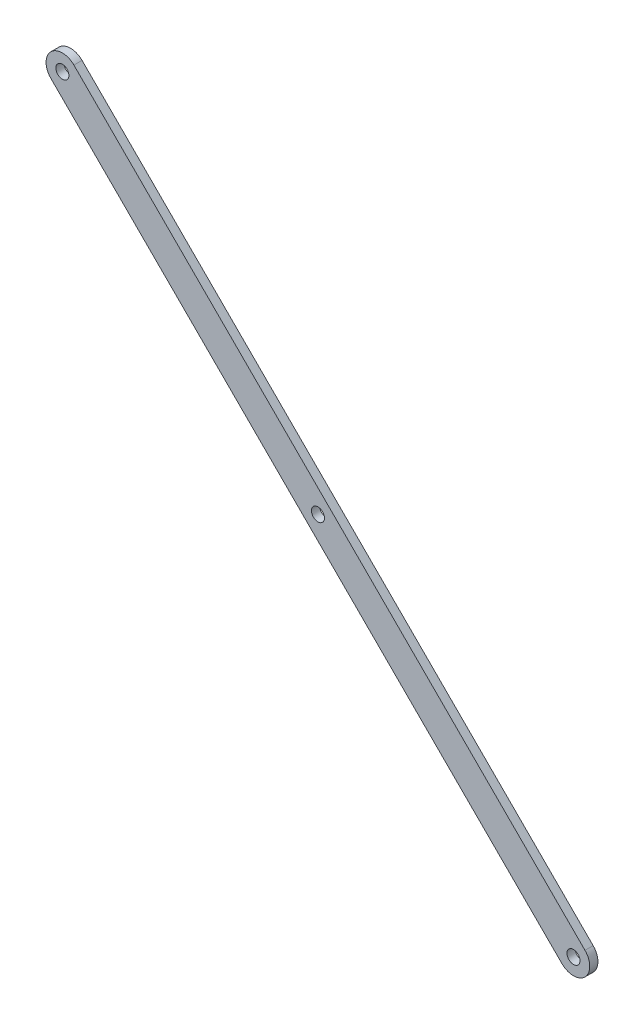
ISO-10303-21;
HEADER;
FILE_DESCRIPTION(('STEP AP214'),'2;1');
FILE_NAME('part.step','',(''),(''),'','','');
FILE_SCHEMA(('AUTOMOTIVE_DESIGN { 1 0 10303 214 1 1 1 1 }'));
ENDSEC;
DATA;
#1=APPLICATION_CONTEXT('core data for automotive mechanical design processes');
#2=APPLICATION_PROTOCOL_DEFINITION('international standard','automotive_design',2000,#1);
#3=PRODUCT_CONTEXT('',#1,'mechanical');
#4=PRODUCT('Part','Part','',(#3));
#5=PRODUCT_RELATED_PRODUCT_CATEGORY('part','',(#4));
#6=PRODUCT_DEFINITION_FORMATION('','',#4);
#7=PRODUCT_DEFINITION_CONTEXT('part definition',#1,'design');
#8=PRODUCT_DEFINITION('design','',#6,#7);
#9=PRODUCT_DEFINITION_SHAPE('','',#8);
#10=(LENGTH_UNIT() NAMED_UNIT(*) SI_UNIT(.MILLI.,.METRE.));
#11=(NAMED_UNIT(*) PLANE_ANGLE_UNIT() SI_UNIT($,.RADIAN.));
#12=(NAMED_UNIT(*) SI_UNIT($,.STERADIAN.) SOLID_ANGLE_UNIT());
#13=UNCERTAINTY_MEASURE_WITH_UNIT(LENGTH_MEASURE(1.E-05),#10,'distance_accuracy_value','');
#14=(GEOMETRIC_REPRESENTATION_CONTEXT(3) GLOBAL_UNCERTAINTY_ASSIGNED_CONTEXT((#13)) GLOBAL_UNIT_ASSIGNED_CONTEXT((#10,
#11,#12)) REPRESENTATION_CONTEXT('',''));
#15=CARTESIAN_POINT('',(0.,0.,0.));
#16=DIRECTION('',(0.,0.,1.));
#17=DIRECTION('',(1.,0.,0.));
#18=AXIS2_PLACEMENT_3D('',#15,#16,#17);
#19=CARTESIAN_POINT('',(0.,0.,5.));
#20=DIRECTION('',(0.,0.,1.));
#21=DIRECTION('',(1.,0.,0.));
#22=AXIS2_PLACEMENT_3D('',#19,#20,#21);
#23=PLANE('',#22);
#24=CARTESIAN_POINT('',(0.,0.,5.));
#25=DIRECTION('',(0.,0.,1.));
#26=DIRECTION('',(1.,0.,0.));
#27=AXIS2_PLACEMENT_3D('',#24,#25,#26);
#28=CIRCLE('',#27,4.);
#29=CARTESIAN_POINT('',(4.,0.,5.));
#30=VERTEX_POINT('',#29);
#31=EDGE_CURVE('E140',#30,#30,#28,.T.);
#32=ORIENTED_EDGE('',*,*,#31,.F.);
#33=EDGE_LOOP('',(#32));
#34=FACE_BOUND('',#33,.T.);
#35=CARTESIAN_POINT('',(0.,0.,5.));
#36=DIRECTION('',(0.,0.,1.));
#37=DIRECTION('',(1.,0.,0.));
#38=AXIS2_PLACEMENT_3D('',#35,#36,#37);
#39=CIRCLE('',#38,10.);
#40=CARTESIAN_POINT('',(-7.07106781186547,-7.07106781186547,5.));
#41=VERTEX_POINT('',#40);
#42=CARTESIAN_POINT('',(7.07106781186547,7.07106781186547,5.));
#43=VERTEX_POINT('',#42);
#44=EDGE_CURVE('E98',#41,#43,#39,.T.);
#45=ORIENTED_EDGE('',*,*,#44,.T.);
#46=DIRECTION('',(-0.707106781186548,0.707106781186548,0.));
#47=VECTOR('',#46,1.);
#48=CARTESIAN_POINT('',(7.07106781186547,7.07106781186547,5.));
#49=LINE('',#48,#47);
#50=CARTESIAN_POINT('',(-306.601500322487,320.743635946218,5.));
#51=VERTEX_POINT('',#50);
#52=EDGE_CURVE('E93',#43,#51,#49,.T.);
#53=ORIENTED_EDGE('',*,*,#52,.T.);
#54=CARTESIAN_POINT('',(-313.672568134353,313.672568134353,5.));
#55=DIRECTION('',(0.,0.,1.));
#56=DIRECTION('',(1.,0.,0.));
#57=AXIS2_PLACEMENT_3D('',#54,#55,#56);
#58=CIRCLE('',#57,9.99999999999996);
#59=CARTESIAN_POINT('',(-320.743635946218,306.601500322487,5.));
#60=VERTEX_POINT('',#59);
#61=EDGE_CURVE('E96',#51,#60,#58,.T.);
#62=ORIENTED_EDGE('',*,*,#61,.T.);
#63=DIRECTION('',(0.707106781186548,-0.707106781186548,0.));
#64=VECTOR('',#63,1.);
#65=CARTESIAN_POINT('',(-7.07106781186547,-7.07106781186547,5.));
#66=LINE('',#65,#64);
#67=EDGE_CURVE('E63',#60,#41,#66,.T.);
#68=ORIENTED_EDGE('',*,*,#67,.T.);
#69=EDGE_LOOP('',(#45,#53,#62,#68));
#70=FACE_BOUND('',#69,.T.);
#71=CARTESIAN_POINT('',(-313.672568134353,313.672568134353,5.));
#72=DIRECTION('',(0.,0.,1.));
#73=DIRECTION('',(1.,0.,0.));
#74=AXIS2_PLACEMENT_3D('',#71,#72,#73);
#75=CIRCLE('',#74,3.99999999999999);
#76=CARTESIAN_POINT('',(-309.672568134353,313.672568134353,5.));
#77=VERTEX_POINT('',#76);
#78=EDGE_CURVE('E118',#77,#77,#75,.T.);
#79=ORIENTED_EDGE('',*,*,#78,.F.);
#80=EDGE_LOOP('',(#79));
#81=FACE_BOUND('',#80,.T.);
#82=CARTESIAN_POINT('',(-156.836284067176,156.836284067176,5.));
#83=DIRECTION('',(0.,0.,1.));
#84=DIRECTION('',(1.,0.,0.));
#85=AXIS2_PLACEMENT_3D('',#82,#83,#84);
#86=CIRCLE('',#85,4.00000000001749);
#87=CARTESIAN_POINT('',(-152.836284067159,156.836284067176,5.));
#88=VERTEX_POINT('',#87);
#89=EDGE_CURVE('E148',#88,#88,#86,.T.);
#90=ORIENTED_EDGE('',*,*,#89,.F.);
#91=EDGE_LOOP('',(#90));
#92=FACE_BOUND('',#91,.T.);
#93=ADVANCED_FACE('F45',(#34,#70,#81,#92),#23,.T.);
#94=CARTESIAN_POINT('',(0.,0.,0.));
#95=DIRECTION('',(0.,0.,1.));
#96=DIRECTION('',(1.,0.,0.));
#97=AXIS2_PLACEMENT_3D('',#94,#95,#96);
#98=PLANE('',#97);
#99=CARTESIAN_POINT('',(0.,0.,0.));
#100=DIRECTION('',(0.,0.,1.));
#101=DIRECTION('',(1.,0.,0.));
#102=AXIS2_PLACEMENT_3D('',#99,#100,#101);
#103=CIRCLE('',#102,10.);
#104=CARTESIAN_POINT('',(-7.07106781186547,-7.07106781186547,0.));
#105=VERTEX_POINT('',#104);
#106=CARTESIAN_POINT('',(7.07106781186547,7.07106781186547,0.));
#107=VERTEX_POINT('',#106);
#108=EDGE_CURVE('E114',#105,#107,#103,.T.);
#109=ORIENTED_EDGE('',*,*,#108,.F.);
#110=DIRECTION('',(0.707106781186548,-0.707106781186548,0.));
#111=VECTOR('',#110,1.);
#112=CARTESIAN_POINT('',(-7.07106781186547,-7.07106781186547,0.));
#113=LINE('',#112,#111);
#114=CARTESIAN_POINT('',(-320.743635946218,306.601500322487,0.));
#115=VERTEX_POINT('',#114);
#116=EDGE_CURVE('E86',#115,#105,#113,.T.);
#117=ORIENTED_EDGE('',*,*,#116,.F.);
#118=CARTESIAN_POINT('',(-313.672568134353,313.672568134353,0.));
#119=DIRECTION('',(0.,0.,1.));
#120=DIRECTION('',(1.,0.,0.));
#121=AXIS2_PLACEMENT_3D('',#118,#119,#120);
#122=CIRCLE('',#121,9.99999999999996);
#123=CARTESIAN_POINT('',(-306.601500322487,320.743635946218,0.));
#124=VERTEX_POINT('',#123);
#125=EDGE_CURVE('E80',#124,#115,#122,.T.);
#126=ORIENTED_EDGE('',*,*,#125,.F.);
#127=DIRECTION('',(-0.707106781186548,0.707106781186548,0.));
#128=VECTOR('',#127,1.);
#129=CARTESIAN_POINT('',(7.07106781186547,7.07106781186547,0.));
#130=LINE('',#129,#128);
#131=EDGE_CURVE('E103',#107,#124,#130,.T.);
#132=ORIENTED_EDGE('',*,*,#131,.F.);
#133=EDGE_LOOP('',(#109,#117,#126,#132));
#134=FACE_BOUND('',#133,.T.);
#135=CARTESIAN_POINT('',(-313.672568134353,313.672568134353,0.));
#136=DIRECTION('',(0.,0.,1.));
#137=DIRECTION('',(1.,0.,0.));
#138=AXIS2_PLACEMENT_3D('',#135,#136,#137);
#139=CIRCLE('',#138,3.99999999999999);
#140=CARTESIAN_POINT('',(-309.672568134353,313.672568134353,0.));
#141=VERTEX_POINT('',#140);
#142=EDGE_CURVE('E136',#141,#141,#139,.T.);
#143=ORIENTED_EDGE('',*,*,#142,.T.);
#144=EDGE_LOOP('',(#143));
#145=FACE_BOUND('',#144,.T.);
#146=CARTESIAN_POINT('',(0.,0.,0.));
#147=DIRECTION('',(0.,0.,1.));
#148=DIRECTION('',(1.,0.,0.));
#149=AXIS2_PLACEMENT_3D('',#146,#147,#148);
#150=CIRCLE('',#149,4.);
#151=CARTESIAN_POINT('',(4.,0.,0.));
#152=VERTEX_POINT('',#151);
#153=EDGE_CURVE('E144',#152,#152,#150,.T.);
#154=ORIENTED_EDGE('',*,*,#153,.T.);
#155=EDGE_LOOP('',(#154));
#156=FACE_BOUND('',#155,.T.);
#157=CARTESIAN_POINT('',(-156.836284067176,156.836284067176,0.));
#158=DIRECTION('',(0.,0.,1.));
#159=DIRECTION('',(1.,0.,0.));
#160=AXIS2_PLACEMENT_3D('',#157,#158,#159);
#161=CIRCLE('',#160,4.00000000001749);
#162=CARTESIAN_POINT('',(-152.836284067159,156.836284067176,0.));
#163=VERTEX_POINT('',#162);
#164=EDGE_CURVE('E152',#163,#163,#161,.T.);
#165=ORIENTED_EDGE('',*,*,#164,.T.);
#166=EDGE_LOOP('',(#165));
#167=FACE_BOUND('',#166,.T.);
#168=ADVANCED_FACE('F131',(#134,#145,#156,#167),#98,.F.);
#169=CARTESIAN_POINT('',(0.,0.,5.));
#170=DIRECTION('',(0.,0.,-1.));
#171=DIRECTION('',(-1.,0.,0.));
#172=AXIS2_PLACEMENT_3D('',#169,#170,#171);
#173=CYLINDRICAL_SURFACE('',#172,10.);
#174=ORIENTED_EDGE('',*,*,#108,.T.);
#175=DIRECTION('',(0.,0.,-1.));
#176=VECTOR('',#175,1.);
#177=CARTESIAN_POINT('',(7.07106781186547,7.07106781186547,5.));
#178=LINE('',#177,#176);
#179=EDGE_CURVE('E11',#43,#107,#178,.T.);
#180=ORIENTED_EDGE('',*,*,#179,.F.);
#181=ORIENTED_EDGE('',*,*,#44,.F.);
#182=DIRECTION('',(0.,0.,-1.));
#183=VECTOR('',#182,1.);
#184=CARTESIAN_POINT('',(-7.07106781186547,-7.07106781186547,5.));
#185=LINE('',#184,#183);
#186=EDGE_CURVE('E110',#41,#105,#185,.T.);
#187=ORIENTED_EDGE('',*,*,#186,.T.);
#188=EDGE_LOOP('',(#174,#180,#181,#187));
#189=FACE_BOUND('',#188,.T.);
#190=ADVANCED_FACE('F47',(#189),#173,.T.);
#191=CARTESIAN_POINT('',(7.07106781186547,7.07106781186547,5.));
#192=DIRECTION('',(-0.707106781186548,-0.707106781186548,0.));
#193=DIRECTION('',(0.707106781186548,-0.707106781186548,0.));
#194=AXIS2_PLACEMENT_3D('',#191,#192,#193);
#195=PLANE('',#194);
#196=ORIENTED_EDGE('',*,*,#131,.T.);
#197=DIRECTION('',(0.,0.,-1.));
#198=VECTOR('',#197,1.);
#199=CARTESIAN_POINT('',(-306.601500322487,320.743635946218,5.));
#200=LINE('',#199,#198);
#201=EDGE_CURVE('E55',#51,#124,#200,.T.);
#202=ORIENTED_EDGE('',*,*,#201,.F.);
#203=ORIENTED_EDGE('',*,*,#52,.F.);
#204=ORIENTED_EDGE('',*,*,#179,.T.);
#205=EDGE_LOOP('',(#196,#202,#203,#204));
#206=FACE_BOUND('',#205,.T.);
#207=ADVANCED_FACE('F102',(#206),#195,.F.);
#208=CARTESIAN_POINT('',(-313.672568134353,313.672568134353,5.));
#209=DIRECTION('',(0.,0.,-1.));
#210=DIRECTION('',(-1.,0.,0.));
#211=AXIS2_PLACEMENT_3D('',#208,#209,#210);
#212=CYLINDRICAL_SURFACE('',#211,9.99999999999996);
#213=ORIENTED_EDGE('',*,*,#125,.T.);
#214=DIRECTION('',(0.,0.,-1.));
#215=VECTOR('',#214,1.);
#216=CARTESIAN_POINT('',(-320.743635946218,306.601500322487,5.));
#217=LINE('',#216,#215);
#218=EDGE_CURVE('E105',#60,#115,#217,.T.);
#219=ORIENTED_EDGE('',*,*,#218,.F.);
#220=ORIENTED_EDGE('',*,*,#61,.F.);
#221=ORIENTED_EDGE('',*,*,#201,.T.);
#222=EDGE_LOOP('',(#213,#219,#220,#221));
#223=FACE_BOUND('',#222,.T.);
#224=ADVANCED_FACE('F106',(#223),#212,.T.);
#225=CARTESIAN_POINT('',(-7.07106781186547,-7.07106781186547,5.));
#226=DIRECTION('',(0.707106781186548,0.707106781186548,0.));
#227=DIRECTION('',(-0.707106781186548,0.707106781186548,0.));
#228=AXIS2_PLACEMENT_3D('',#225,#226,#227);
#229=PLANE('',#228);
#230=ORIENTED_EDGE('',*,*,#116,.T.);
#231=ORIENTED_EDGE('',*,*,#186,.F.);
#232=ORIENTED_EDGE('',*,*,#67,.F.);
#233=ORIENTED_EDGE('',*,*,#218,.T.);
#234=EDGE_LOOP('',(#230,#231,#232,#233));
#235=FACE_BOUND('',#234,.T.);
#236=ADVANCED_FACE('F128',(#235),#229,.F.);
#237=CARTESIAN_POINT('',(-313.672568134353,313.672568134353,5.));
#238=DIRECTION('',(0.,0.,-1.));
#239=DIRECTION('',(-1.,0.,0.));
#240=AXIS2_PLACEMENT_3D('',#237,#238,#239);
#241=CYLINDRICAL_SURFACE('',#240,3.99999999999999);
#242=ORIENTED_EDGE('',*,*,#78,.T.);
#243=EDGE_LOOP('',(#242));
#244=FACE_BOUND('',#243,.T.);
#245=ORIENTED_EDGE('',*,*,#142,.F.);
#246=EDGE_LOOP('',(#245));
#247=FACE_BOUND('',#246,.T.);
#248=ADVANCED_FACE('F172',(#244,#247),#241,.F.);
#249=CARTESIAN_POINT('',(0.,0.,5.));
#250=DIRECTION('',(0.,0.,-1.));
#251=DIRECTION('',(-1.,0.,0.));
#252=AXIS2_PLACEMENT_3D('',#249,#250,#251);
#253=CYLINDRICAL_SURFACE('',#252,4.);
#254=ORIENTED_EDGE('',*,*,#31,.T.);
#255=EDGE_LOOP('',(#254));
#256=FACE_BOUND('',#255,.T.);
#257=ORIENTED_EDGE('',*,*,#153,.F.);
#258=EDGE_LOOP('',(#257));
#259=FACE_BOUND('',#258,.T.);
#260=ADVANCED_FACE('F217',(#256,#259),#253,.F.);
#261=CARTESIAN_POINT('',(-156.836284067176,156.836284067176,5.));
#262=DIRECTION('',(0.,0.,-1.));
#263=DIRECTION('',(-1.,0.,0.));
#264=AXIS2_PLACEMENT_3D('',#261,#262,#263);
#265=CYLINDRICAL_SURFACE('',#264,4.00000000001749);
#266=ORIENTED_EDGE('',*,*,#89,.T.);
#267=EDGE_LOOP('',(#266));
#268=FACE_BOUND('',#267,.T.);
#269=ORIENTED_EDGE('',*,*,#164,.F.);
#270=EDGE_LOOP('',(#269));
#271=FACE_BOUND('',#270,.T.);
#272=ADVANCED_FACE('F160',(#268,#271),#265,.F.);
#273=CLOSED_SHELL('',(#93,#168,#190,#207,#224,#236,#248,#260,#272));
#274=MANIFOLD_SOLID_BREP('B2',#273);
#275=ADVANCED_BREP_SHAPE_REPRESENTATION('',(#18,#274),#14);
#276=SHAPE_DEFINITION_REPRESENTATION(#9,#275);
ENDSEC;
END-ISO-10303-21;
